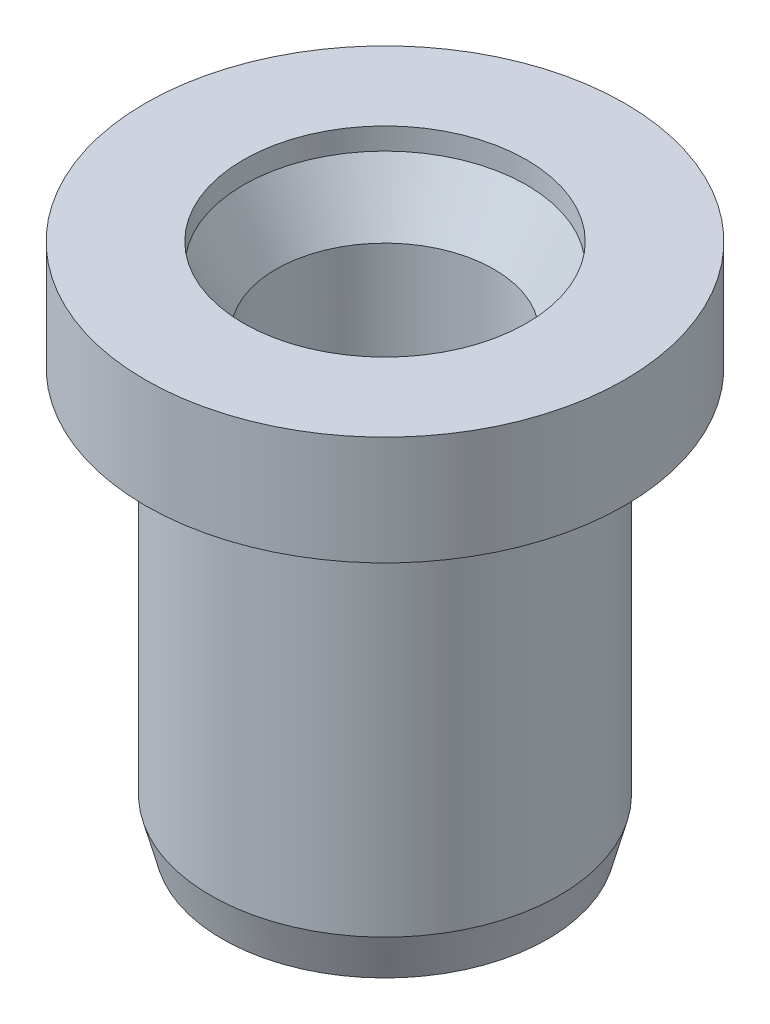
ISO-10303-21;
HEADER;
FILE_DESCRIPTION(('STEP AP214'),'2;1');
FILE_NAME('part.step','',(''),(''),'','','');
FILE_SCHEMA(('AUTOMOTIVE_DESIGN { 1 0 10303 214 1 1 1 1 }'));
ENDSEC;
DATA;
#1=APPLICATION_CONTEXT('core data for automotive mechanical design processes');
#2=APPLICATION_PROTOCOL_DEFINITION('international standard','automotive_design',2000,#1);
#3=PRODUCT_CONTEXT('',#1,'mechanical');
#4=PRODUCT('Part','Part','',(#3));
#5=PRODUCT_RELATED_PRODUCT_CATEGORY('part','',(#4));
#6=PRODUCT_DEFINITION_FORMATION('','',#4);
#7=PRODUCT_DEFINITION_CONTEXT('part definition',#1,'design');
#8=PRODUCT_DEFINITION('design','',#6,#7);
#9=PRODUCT_DEFINITION_SHAPE('','',#8);
#10=(LENGTH_UNIT() NAMED_UNIT(*) SI_UNIT(.MILLI.,.METRE.));
#11=(NAMED_UNIT(*) PLANE_ANGLE_UNIT() SI_UNIT($,.RADIAN.));
#12=(NAMED_UNIT(*) SI_UNIT($,.STERADIAN.) SOLID_ANGLE_UNIT());
#13=UNCERTAINTY_MEASURE_WITH_UNIT(LENGTH_MEASURE(1.E-05),#10,'distance_accuracy_value','');
#14=(GEOMETRIC_REPRESENTATION_CONTEXT(3) GLOBAL_UNCERTAINTY_ASSIGNED_CONTEXT((#13)) GLOBAL_UNIT_ASSIGNED_CONTEXT((#10,
#11,#12)) REPRESENTATION_CONTEXT('',''));
#15=CARTESIAN_POINT('',(0.,0.,0.));
#16=DIRECTION('',(0.,0.,1.));
#17=DIRECTION('',(1.,0.,0.));
#18=AXIS2_PLACEMENT_3D('',#15,#16,#17);
#19=CARTESIAN_POINT('',(0.,0.,0.));
#20=DIRECTION('',(0.,-1.,0.));
#21=DIRECTION('',(0.,0.,-1.));
#22=AXIS2_PLACEMENT_3D('',#19,#20,#21);
#23=PLANE('',#22);
#24=CARTESIAN_POINT('',(0.,0.,0.));
#25=DIRECTION('',(0.,-1.,0.));
#26=DIRECTION('',(0.,0.,-1.));
#27=AXIS2_PLACEMENT_3D('',#24,#25,#26);
#28=CIRCLE('',#27,3.73205080756888);
#29=CARTESIAN_POINT('',(0.,0.,-3.73205080756888));
#30=VERTEX_POINT('',#29);
#31=EDGE_CURVE('E51',#30,#30,#28,.T.);
#32=ORIENTED_EDGE('',*,*,#31,.T.);
#33=EDGE_LOOP('',(#32));
#34=FACE_BOUND('',#33,.T.);
#35=CARTESIAN_POINT('',(0.,0.,0.));
#36=DIRECTION('',(0.,1.,0.));
#37=DIRECTION('',(0.,0.,1.));
#38=AXIS2_PLACEMENT_3D('',#35,#36,#37);
#39=CIRCLE('',#38,2.5);
#40=CARTESIAN_POINT('',(0.,0.,2.5));
#41=VERTEX_POINT('',#40);
#42=EDGE_CURVE('E73',#41,#41,#39,.T.);
#43=ORIENTED_EDGE('',*,*,#42,.T.);
#44=EDGE_LOOP('',(#43));
#45=FACE_BOUND('',#44,.T.);
#46=ADVANCED_FACE('F43',(#34,#45),#23,.T.);
#47=CARTESIAN_POINT('',(0.,-5.,0.));
#48=DIRECTION('',(0.,-1.,0.));
#49=DIRECTION('',(0.,0.,-1.));
#50=AXIS2_PLACEMENT_3D('',#47,#48,#49);
#51=CYLINDRICAL_SURFACE('',#50,4.);
#52=CARTESIAN_POINT('',(0.,1.00000000000002,0.));
#53=DIRECTION('',(0.,-1.,0.));
#54=DIRECTION('',(0.,0.,-1.));
#55=AXIS2_PLACEMENT_3D('',#52,#53,#54);
#56=CIRCLE('',#55,4.);
#57=CARTESIAN_POINT('',(0.,1.00000000000002,-4.));
#58=VERTEX_POINT('',#57);
#59=EDGE_CURVE('E10',#58,#58,#56,.F.);
#60=ORIENTED_EDGE('',*,*,#59,.T.);
#61=EDGE_LOOP('',(#60));
#62=FACE_BOUND('',#61,.T.);
#63=CARTESIAN_POINT('',(0.,9.3,0.));
#64=DIRECTION('',(0.,-1.,0.));
#65=DIRECTION('',(0.,0.,-1.));
#66=AXIS2_PLACEMENT_3D('',#63,#64,#65);
#67=CIRCLE('',#66,4.);
#68=CARTESIAN_POINT('',(0.,9.3,-4.));
#69=VERTEX_POINT('',#68);
#70=EDGE_CURVE('E55',#69,#69,#67,.T.);
#71=ORIENTED_EDGE('',*,*,#70,.T.);
#72=EDGE_LOOP('',(#71));
#73=FACE_BOUND('',#72,.T.);
#74=ADVANCED_FACE('F96',(#62,#73),#51,.T.);
#75=CARTESIAN_POINT('',(4.,9.3,0.));
#76=DIRECTION('',(0.,1.,0.));
#77=DIRECTION('',(0.,0.,1.));
#78=AXIS2_PLACEMENT_3D('',#75,#76,#77);
#79=PLANE('',#78);
#80=CARTESIAN_POINT('',(0.,9.3,0.));
#81=DIRECTION('',(0.,-1.,0.));
#82=DIRECTION('',(0.,0.,-1.));
#83=AXIS2_PLACEMENT_3D('',#80,#81,#82);
#84=CIRCLE('',#83,3.8);
#85=CARTESIAN_POINT('',(0.,9.3,-3.8));
#86=VERTEX_POINT('',#85);
#87=EDGE_CURVE('E59',#86,#86,#84,.T.);
#88=ORIENTED_EDGE('',*,*,#87,.T.);
#89=EDGE_LOOP('',(#88));
#90=FACE_BOUND('',#89,.T.);
#91=ORIENTED_EDGE('',*,*,#70,.F.);
#92=EDGE_LOOP('',(#91));
#93=FACE_BOUND('',#92,.T.);
#94=ADVANCED_FACE('F101',(#90,#93),#79,.T.);
#95=CARTESIAN_POINT('',(0.,-5.,0.));
#96=DIRECTION('',(0.,-1.,0.));
#97=DIRECTION('',(0.,0.,-1.));
#98=AXIS2_PLACEMENT_3D('',#95,#96,#97);
#99=CYLINDRICAL_SURFACE('',#98,3.8);
#100=CARTESIAN_POINT('',(0.,9.5,0.));
#101=DIRECTION('',(0.,-1.,0.));
#102=DIRECTION('',(0.,0.,-1.));
#103=AXIS2_PLACEMENT_3D('',#100,#101,#102);
#104=CIRCLE('',#103,3.8);
#105=CARTESIAN_POINT('',(0.,9.5,-3.8));
#106=VERTEX_POINT('',#105);
#107=EDGE_CURVE('E64',#106,#106,#104,.T.);
#108=ORIENTED_EDGE('',*,*,#107,.T.);
#109=EDGE_LOOP('',(#108));
#110=FACE_BOUND('',#109,.T.);
#111=ORIENTED_EDGE('',*,*,#87,.F.);
#112=EDGE_LOOP('',(#111));
#113=FACE_BOUND('',#112,.T.);
#114=ADVANCED_FACE('F106',(#110,#113),#99,.T.);
#115=CARTESIAN_POINT('',(3.8,9.5,0.));
#116=DIRECTION('',(0.,-1.,0.));
#117=DIRECTION('',(0.,0.,-1.));
#118=AXIS2_PLACEMENT_3D('',#115,#116,#117);
#119=PLANE('',#118);
#120=CARTESIAN_POINT('',(0.,9.5,0.));
#121=DIRECTION('',(0.,-1.,0.));
#122=DIRECTION('',(0.,0.,-1.));
#123=AXIS2_PLACEMENT_3D('',#120,#121,#122);
#124=CIRCLE('',#123,5.5);
#125=CARTESIAN_POINT('',(0.,9.5,-5.5));
#126=VERTEX_POINT('',#125);
#127=EDGE_CURVE('E67',#126,#126,#124,.T.);
#128=ORIENTED_EDGE('',*,*,#127,.T.);
#129=EDGE_LOOP('',(#128));
#130=FACE_BOUND('',#129,.T.);
#131=ORIENTED_EDGE('',*,*,#107,.F.);
#132=EDGE_LOOP('',(#131));
#133=FACE_BOUND('',#132,.T.);
#134=ADVANCED_FACE('F110',(#130,#133),#119,.T.);
#135=CARTESIAN_POINT('',(0.,-5.,0.));
#136=DIRECTION('',(0.,-1.,0.));
#137=DIRECTION('',(0.,0.,-1.));
#138=AXIS2_PLACEMENT_3D('',#135,#136,#137);
#139=CYLINDRICAL_SURFACE('',#138,5.5);
#140=CARTESIAN_POINT('',(0.,12.,0.));
#141=DIRECTION('',(0.,-1.,0.));
#142=DIRECTION('',(0.,0.,-1.));
#143=AXIS2_PLACEMENT_3D('',#140,#141,#142);
#144=CIRCLE('',#143,5.5);
#145=CARTESIAN_POINT('',(0.,12.,-5.5));
#146=VERTEX_POINT('',#145);
#147=EDGE_CURVE('E70',#146,#146,#144,.T.);
#148=ORIENTED_EDGE('',*,*,#147,.T.);
#149=EDGE_LOOP('',(#148));
#150=FACE_BOUND('',#149,.T.);
#151=ORIENTED_EDGE('',*,*,#127,.F.);
#152=EDGE_LOOP('',(#151));
#153=FACE_BOUND('',#152,.T.);
#154=ADVANCED_FACE('F114',(#150,#153),#139,.T.);
#155=CARTESIAN_POINT('',(5.5,12.,0.));
#156=DIRECTION('',(0.,1.,0.));
#157=DIRECTION('',(0.,0.,1.));
#158=AXIS2_PLACEMENT_3D('',#155,#156,#157);
#159=PLANE('',#158);
#160=CARTESIAN_POINT('',(0.,12.,0.));
#161=DIRECTION('',(0.,-1.,0.));
#162=DIRECTION('',(0.,0.,-1.));
#163=AXIS2_PLACEMENT_3D('',#160,#161,#162);
#164=CIRCLE('',#163,3.25);
#165=CARTESIAN_POINT('',(0.,12.,-3.25));
#166=VERTEX_POINT('',#165);
#167=EDGE_CURVE('E76',#166,#166,#164,.T.);
#168=ORIENTED_EDGE('',*,*,#167,.T.);
#169=EDGE_LOOP('',(#168));
#170=FACE_BOUND('',#169,.T.);
#171=ORIENTED_EDGE('',*,*,#147,.F.);
#172=EDGE_LOOP('',(#171));
#173=FACE_BOUND('',#172,.T.);
#174=ADVANCED_FACE('F91',(#170,#173),#159,.T.);
#175=CARTESIAN_POINT('',(0.,0.,0.));
#176=DIRECTION('',(0.,1.,0.));
#177=DIRECTION('',(0.,0.,1.));
#178=AXIS2_PLACEMENT_3D('',#175,#176,#177);
#179=CYLINDRICAL_SURFACE('',#178,2.5);
#180=CARTESIAN_POINT('',(0.,10.2009618943233,0.));
#181=DIRECTION('',(0.,-1.,0.));
#182=DIRECTION('',(0.,0.,-1.));
#183=AXIS2_PLACEMENT_3D('',#180,#181,#182);
#184=CIRCLE('',#183,2.5);
#185=CARTESIAN_POINT('',(0.,10.2009618943233,-2.5));
#186=VERTEX_POINT('',#185);
#187=EDGE_CURVE('E82',#186,#186,#184,.T.);
#188=ORIENTED_EDGE('',*,*,#187,.F.);
#189=EDGE_LOOP('',(#188));
#190=FACE_BOUND('',#189,.T.);
#191=ORIENTED_EDGE('',*,*,#42,.F.);
#192=EDGE_LOOP('',(#191));
#193=FACE_BOUND('',#192,.T.);
#194=ADVANCED_FACE('F88',(#190,#193),#179,.F.);
#195=CARTESIAN_POINT('',(0.,0.,0.));
#196=DIRECTION('',(0.,1.,0.));
#197=DIRECTION('',(0.,0.,1.));
#198=AXIS2_PLACEMENT_3D('',#195,#196,#197);
#199=CONICAL_SURFACE('',#198,3.73205080756888,0.261799387799146);
#200=ORIENTED_EDGE('',*,*,#59,.F.);
#201=EDGE_LOOP('',(#200));
#202=FACE_BOUND('',#201,.T.);
#203=ORIENTED_EDGE('',*,*,#31,.F.);
#204=EDGE_LOOP('',(#203));
#205=FACE_BOUND('',#204,.T.);
#206=ADVANCED_FACE('F46',(#202,#205),#199,.T.);
#207=CARTESIAN_POINT('',(0.,-5.,0.));
#208=DIRECTION('',(0.,-1.,0.));
#209=DIRECTION('',(0.,0.,-1.));
#210=AXIS2_PLACEMENT_3D('',#207,#208,#209);
#211=CYLINDRICAL_SURFACE('',#210,3.25);
#212=ORIENTED_EDGE('',*,*,#167,.F.);
#213=EDGE_LOOP('',(#212));
#214=FACE_BOUND('',#213,.T.);
#215=CARTESIAN_POINT('',(0.,11.5,0.));
#216=DIRECTION('',(0.,-1.,0.));
#217=DIRECTION('',(0.,0.,-1.));
#218=AXIS2_PLACEMENT_3D('',#215,#216,#217);
#219=CIRCLE('',#218,3.25);
#220=CARTESIAN_POINT('',(0.,11.5,-3.25));
#221=VERTEX_POINT('',#220);
#222=EDGE_CURVE('E79',#221,#221,#219,.T.);
#223=ORIENTED_EDGE('',*,*,#222,.T.);
#224=EDGE_LOOP('',(#223));
#225=FACE_BOUND('',#224,.T.);
#226=ADVANCED_FACE('F121',(#214,#225),#211,.F.);
#227=CARTESIAN_POINT('',(0.,10.2009618943233,0.));
#228=DIRECTION('',(0.,1.,0.));
#229=DIRECTION('',(0.,0.,1.));
#230=AXIS2_PLACEMENT_3D('',#227,#228,#229);
#231=CONICAL_SURFACE('',#230,2.5,0.523598775598293);
#232=ORIENTED_EDGE('',*,*,#222,.F.);
#233=EDGE_LOOP('',(#232));
#234=FACE_BOUND('',#233,.T.);
#235=ORIENTED_EDGE('',*,*,#187,.T.);
#236=EDGE_LOOP('',(#235));
#237=FACE_BOUND('',#236,.T.);
#238=ADVANCED_FACE('F86',(#234,#237),#231,.F.);
#239=CLOSED_SHELL('',(#46,#74,#94,#114,#134,#154,#174,#194,#206,#226,#238));
#240=MANIFOLD_SOLID_BREP('B2',#239);
#241=ADVANCED_BREP_SHAPE_REPRESENTATION('',(#18,#240),#14);
#242=SHAPE_DEFINITION_REPRESENTATION(#9,#241);
ENDSEC;
END-ISO-10303-21;
